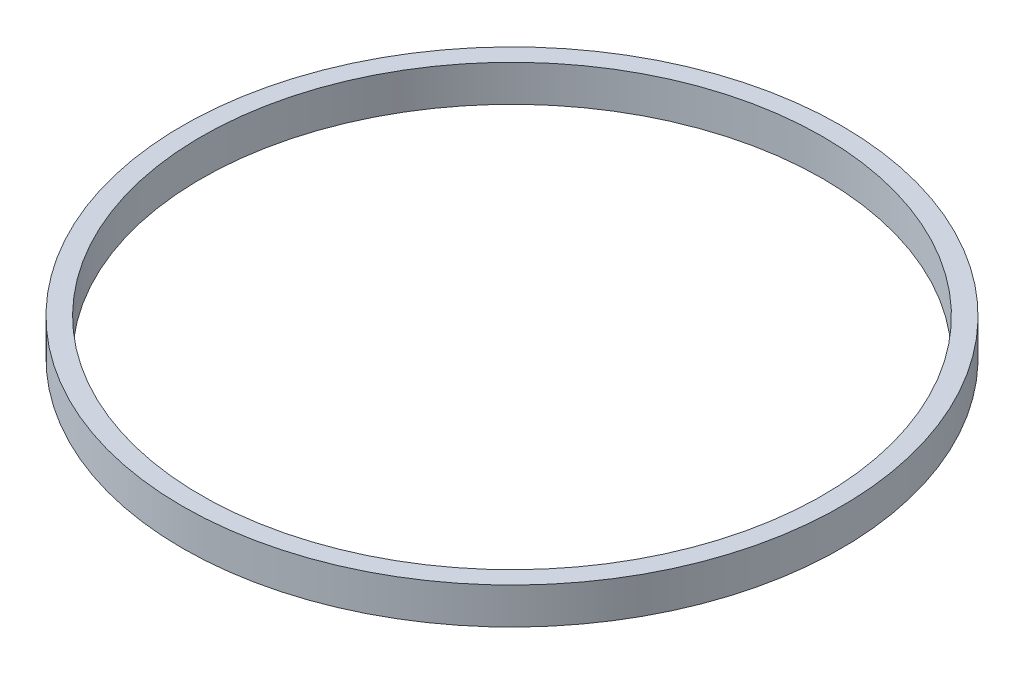
ISO-10303-21;
HEADER;
FILE_DESCRIPTION(('STEP AP214'),'2;1');
FILE_NAME('part.step','',(''),(''),'','','');
FILE_SCHEMA(('AUTOMOTIVE_DESIGN { 1 0 10303 214 1 1 1 1 }'));
ENDSEC;
DATA;
#1=APPLICATION_CONTEXT('core data for automotive mechanical design processes');
#2=APPLICATION_PROTOCOL_DEFINITION('international standard','automotive_design',2000,#1);
#3=PRODUCT_CONTEXT('',#1,'mechanical');
#4=PRODUCT('Part','Part','',(#3));
#5=PRODUCT_RELATED_PRODUCT_CATEGORY('part','',(#4));
#6=PRODUCT_DEFINITION_FORMATION('','',#4);
#7=PRODUCT_DEFINITION_CONTEXT('part definition',#1,'design');
#8=PRODUCT_DEFINITION('design','',#6,#7);
#9=PRODUCT_DEFINITION_SHAPE('','',#8);
#10=(LENGTH_UNIT() NAMED_UNIT(*) SI_UNIT(.MILLI.,.METRE.));
#11=(NAMED_UNIT(*) PLANE_ANGLE_UNIT() SI_UNIT($,.RADIAN.));
#12=(NAMED_UNIT(*) SI_UNIT($,.STERADIAN.) SOLID_ANGLE_UNIT());
#13=UNCERTAINTY_MEASURE_WITH_UNIT(LENGTH_MEASURE(1.E-05),#10,'distance_accuracy_value','');
#14=(GEOMETRIC_REPRESENTATION_CONTEXT(3) GLOBAL_UNCERTAINTY_ASSIGNED_CONTEXT((#13)) GLOBAL_UNIT_ASSIGNED_CONTEXT((#10,
#11,#12)) REPRESENTATION_CONTEXT('',''));
#15=CARTESIAN_POINT('',(0.,0.,0.));
#16=DIRECTION('',(0.,0.,1.));
#17=DIRECTION('',(1.,0.,0.));
#18=AXIS2_PLACEMENT_3D('',#15,#16,#17);
#19=CARTESIAN_POINT('',(0.,0.,0.));
#20=DIRECTION('',(0.,-1.,0.));
#21=DIRECTION('',(0.,0.,-1.));
#22=AXIS2_PLACEMENT_3D('',#19,#20,#21);
#23=CYLINDRICAL_SURFACE('',#22,23.5712);
#24=CARTESIAN_POINT('',(0.,0.,0.));
#25=DIRECTION('',(0.,-1.,0.));
#26=DIRECTION('',(0.,0.,-1.));
#27=AXIS2_PLACEMENT_3D('',#24,#25,#26);
#28=CIRCLE('',#27,23.5712);
#29=CARTESIAN_POINT('',(0.,0.,-23.5712));
#30=VERTEX_POINT('',#29);
#31=EDGE_CURVE('E10',#30,#30,#28,.T.);
#32=ORIENTED_EDGE('',*,*,#31,.F.);
#33=EDGE_LOOP('',(#32));
#34=FACE_BOUND('',#33,.T.);
#35=CARTESIAN_POINT('',(0.,2.6035,0.));
#36=DIRECTION('',(0.,-1.,0.));
#37=DIRECTION('',(0.,0.,-1.));
#38=AXIS2_PLACEMENT_3D('',#35,#36,#37);
#39=CIRCLE('',#38,23.5712);
#40=CARTESIAN_POINT('',(0.,2.6035,-23.5712));
#41=VERTEX_POINT('',#40);
#42=EDGE_CURVE('E45',#41,#41,#39,.T.);
#43=ORIENTED_EDGE('',*,*,#42,.T.);
#44=EDGE_LOOP('',(#43));
#45=FACE_BOUND('',#44,.T.);
#46=ADVANCED_FACE('F31',(#34,#45),#23,.T.);
#47=CARTESIAN_POINT('',(-22.225,0.,0.));
#48=DIRECTION('',(0.,1.,0.));
#49=DIRECTION('',(0.,0.,1.));
#50=AXIS2_PLACEMENT_3D('',#47,#48,#49);
#51=PLANE('',#50);
#52=CARTESIAN_POINT('',(0.,0.,0.));
#53=DIRECTION('',(0.,-1.,0.));
#54=DIRECTION('',(0.,0.,-1.));
#55=AXIS2_PLACEMENT_3D('',#52,#53,#54);
#56=CIRCLE('',#55,22.225);
#57=CARTESIAN_POINT('',(0.,0.,-22.225));
#58=VERTEX_POINT('',#57);
#59=EDGE_CURVE('E37',#58,#58,#56,.T.);
#60=ORIENTED_EDGE('',*,*,#59,.F.);
#61=EDGE_LOOP('',(#60));
#62=FACE_BOUND('',#61,.T.);
#63=ORIENTED_EDGE('',*,*,#31,.T.);
#64=EDGE_LOOP('',(#63));
#65=FACE_BOUND('',#64,.T.);
#66=ADVANCED_FACE('F60',(#62,#65),#51,.F.);
#67=CARTESIAN_POINT('',(0.,0.,0.));
#68=DIRECTION('',(0.,-1.,0.));
#69=DIRECTION('',(0.,0.,-1.));
#70=AXIS2_PLACEMENT_3D('',#67,#68,#69);
#71=CYLINDRICAL_SURFACE('',#70,22.225);
#72=CARTESIAN_POINT('',(0.,2.6035,0.));
#73=DIRECTION('',(0.,-1.,0.));
#74=DIRECTION('',(0.,0.,-1.));
#75=AXIS2_PLACEMENT_3D('',#72,#73,#74);
#76=CIRCLE('',#75,22.225);
#77=CARTESIAN_POINT('',(0.,2.6035,-22.225));
#78=VERTEX_POINT('',#77);
#79=EDGE_CURVE('E41',#78,#78,#76,.T.);
#80=ORIENTED_EDGE('',*,*,#79,.F.);
#81=EDGE_LOOP('',(#80));
#82=FACE_BOUND('',#81,.T.);
#83=ORIENTED_EDGE('',*,*,#59,.T.);
#84=EDGE_LOOP('',(#83));
#85=FACE_BOUND('',#84,.T.);
#86=ADVANCED_FACE('F55',(#82,#85),#71,.F.);
#87=CARTESIAN_POINT('',(-22.225,2.6035,0.));
#88=DIRECTION('',(0.,-1.,0.));
#89=DIRECTION('',(0.,0.,-1.));
#90=AXIS2_PLACEMENT_3D('',#87,#88,#89);
#91=PLANE('',#90);
#92=ORIENTED_EDGE('',*,*,#42,.F.);
#93=EDGE_LOOP('',(#92));
#94=FACE_BOUND('',#93,.T.);
#95=ORIENTED_EDGE('',*,*,#79,.T.);
#96=EDGE_LOOP('',(#95));
#97=FACE_BOUND('',#96,.T.);
#98=ADVANCED_FACE('F52',(#94,#97),#91,.F.);
#99=CLOSED_SHELL('',(#46,#66,#86,#98));
#100=MANIFOLD_SOLID_BREP('B2',#99);
#101=ADVANCED_BREP_SHAPE_REPRESENTATION('',(#18,#100),#14);
#102=SHAPE_DEFINITION_REPRESENTATION(#9,#101);
ENDSEC;
END-ISO-10303-21;
